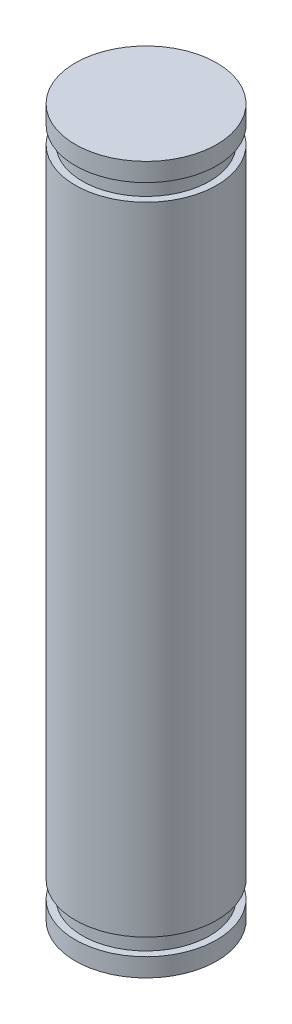
ISO-10303-21;
HEADER;
FILE_DESCRIPTION(('STEP AP214'),'2;1');
FILE_NAME('part.step','',(''),(''),'','','');
FILE_SCHEMA(('AUTOMOTIVE_DESIGN { 1 0 10303 214 1 1 1 1 }'));
ENDSEC;
DATA;
#1=APPLICATION_CONTEXT('core data for automotive mechanical design processes');
#2=APPLICATION_PROTOCOL_DEFINITION('international standard','automotive_design',2000,#1);
#3=PRODUCT_CONTEXT('',#1,'mechanical');
#4=PRODUCT('Part','Part','',(#3));
#5=PRODUCT_RELATED_PRODUCT_CATEGORY('part','',(#4));
#6=PRODUCT_DEFINITION_FORMATION('','',#4);
#7=PRODUCT_DEFINITION_CONTEXT('part definition',#1,'design');
#8=PRODUCT_DEFINITION('design','',#6,#7);
#9=PRODUCT_DEFINITION_SHAPE('','',#8);
#10=(LENGTH_UNIT() NAMED_UNIT(*) SI_UNIT(.MILLI.,.METRE.));
#11=(NAMED_UNIT(*) PLANE_ANGLE_UNIT() SI_UNIT($,.RADIAN.));
#12=(NAMED_UNIT(*) SI_UNIT($,.STERADIAN.) SOLID_ANGLE_UNIT());
#13=UNCERTAINTY_MEASURE_WITH_UNIT(LENGTH_MEASURE(1.E-05),#10,'distance_accuracy_value','');
#14=(GEOMETRIC_REPRESENTATION_CONTEXT(3) GLOBAL_UNCERTAINTY_ASSIGNED_CONTEXT((#13)) GLOBAL_UNIT_ASSIGNED_CONTEXT((#10,
#11,#12)) REPRESENTATION_CONTEXT('',''));
#15=CARTESIAN_POINT('',(0.,0.,0.));
#16=DIRECTION('',(0.,0.,1.));
#17=DIRECTION('',(1.,0.,0.));
#18=AXIS2_PLACEMENT_3D('',#15,#16,#17);
#19=CARTESIAN_POINT('',(0.,0.,0.));
#20=DIRECTION('',(0.,-1.,0.));
#21=DIRECTION('',(0.,0.,-1.));
#22=AXIS2_PLACEMENT_3D('',#19,#20,#21);
#23=PLANE('',#22);
#24=CARTESIAN_POINT('',(0.,0.,0.));
#25=DIRECTION('',(0.,-1.,0.));
#26=DIRECTION('',(0.,0.,-1.));
#27=AXIS2_PLACEMENT_3D('',#24,#25,#26);
#28=CIRCLE('',#27,5.);
#29=CARTESIAN_POINT('',(0.,0.,-5.));
#30=VERTEX_POINT('',#29);
#31=EDGE_CURVE('E10',#30,#30,#28,.T.);
#32=ORIENTED_EDGE('',*,*,#31,.T.);
#33=EDGE_LOOP('',(#32));
#34=FACE_BOUND('',#33,.T.);
#35=ADVANCED_FACE('F37',(#34),#23,.T.);
#36=CARTESIAN_POINT('',(0.,0.,0.));
#37=DIRECTION('',(0.,-1.,0.));
#38=DIRECTION('',(0.,0.,-1.));
#39=AXIS2_PLACEMENT_3D('',#36,#37,#38);
#40=CYLINDRICAL_SURFACE('',#39,5.);
#41=CARTESIAN_POINT('',(0.,1.3,0.));
#42=DIRECTION('',(0.,-1.,0.));
#43=DIRECTION('',(0.,0.,-1.));
#44=AXIS2_PLACEMENT_3D('',#41,#42,#43);
#45=CIRCLE('',#44,5.);
#46=CARTESIAN_POINT('',(0.,1.3,-5.));
#47=VERTEX_POINT('',#46);
#48=EDGE_CURVE('E44',#47,#47,#45,.T.);
#49=ORIENTED_EDGE('',*,*,#48,.T.);
#50=EDGE_LOOP('',(#49));
#51=FACE_BOUND('',#50,.T.);
#52=ORIENTED_EDGE('',*,*,#31,.F.);
#53=EDGE_LOOP('',(#52));
#54=FACE_BOUND('',#53,.T.);
#55=ADVANCED_FACE('F97',(#51,#54),#40,.T.);
#56=CARTESIAN_POINT('',(5.,1.3,0.));
#57=DIRECTION('',(0.,1.,0.));
#58=DIRECTION('',(0.,0.,1.));
#59=AXIS2_PLACEMENT_3D('',#56,#57,#58);
#60=PLANE('',#59);
#61=CARTESIAN_POINT('',(0.,1.3,0.));
#62=DIRECTION('',(0.,-1.,0.));
#63=DIRECTION('',(0.,0.,-1.));
#64=AXIS2_PLACEMENT_3D('',#61,#62,#63);
#65=CIRCLE('',#64,4.5);
#66=CARTESIAN_POINT('',(0.,1.3,-4.5));
#67=VERTEX_POINT('',#66);
#68=EDGE_CURVE('E49',#67,#67,#65,.T.);
#69=ORIENTED_EDGE('',*,*,#68,.T.);
#70=EDGE_LOOP('',(#69));
#71=FACE_BOUND('',#70,.T.);
#72=ORIENTED_EDGE('',*,*,#48,.F.);
#73=EDGE_LOOP('',(#72));
#74=FACE_BOUND('',#73,.T.);
#75=ADVANCED_FACE('F101',(#71,#74),#60,.T.);
#76=CARTESIAN_POINT('',(0.,0.,0.));
#77=DIRECTION('',(0.,-1.,0.));
#78=DIRECTION('',(0.,0.,-1.));
#79=AXIS2_PLACEMENT_3D('',#76,#77,#78);
#80=CYLINDRICAL_SURFACE('',#79,4.5);
#81=CARTESIAN_POINT('',(0.,2.5,0.));
#82=DIRECTION('',(0.,-1.,0.));
#83=DIRECTION('',(0.,0.,-1.));
#84=AXIS2_PLACEMENT_3D('',#81,#82,#83);
#85=CIRCLE('',#84,4.5);
#86=CARTESIAN_POINT('',(0.,2.5,-4.5));
#87=VERTEX_POINT('',#86);
#88=EDGE_CURVE('E54',#87,#87,#85,.T.);
#89=ORIENTED_EDGE('',*,*,#88,.T.);
#90=EDGE_LOOP('',(#89));
#91=FACE_BOUND('',#90,.T.);
#92=ORIENTED_EDGE('',*,*,#68,.F.);
#93=EDGE_LOOP('',(#92));
#94=FACE_BOUND('',#93,.T.);
#95=ADVANCED_FACE('F105',(#91,#94),#80,.T.);
#96=CARTESIAN_POINT('',(4.5,2.5,0.));
#97=DIRECTION('',(0.,-1.,0.));
#98=DIRECTION('',(0.,0.,-1.));
#99=AXIS2_PLACEMENT_3D('',#96,#97,#98);
#100=PLANE('',#99);
#101=CARTESIAN_POINT('',(0.,2.5,0.));
#102=DIRECTION('',(0.,-1.,0.));
#103=DIRECTION('',(0.,0.,-1.));
#104=AXIS2_PLACEMENT_3D('',#101,#102,#103);
#105=CIRCLE('',#104,5.);
#106=CARTESIAN_POINT('',(0.,2.5,-5.));
#107=VERTEX_POINT('',#106);
#108=EDGE_CURVE('E60',#107,#107,#105,.T.);
#109=ORIENTED_EDGE('',*,*,#108,.T.);
#110=EDGE_LOOP('',(#109));
#111=FACE_BOUND('',#110,.T.);
#112=ORIENTED_EDGE('',*,*,#88,.F.);
#113=EDGE_LOOP('',(#112));
#114=FACE_BOUND('',#113,.T.);
#115=ADVANCED_FACE('F112',(#111,#114),#100,.T.);
#116=CARTESIAN_POINT('',(0.,0.,0.));
#117=DIRECTION('',(0.,-1.,0.));
#118=DIRECTION('',(0.,0.,-1.));
#119=AXIS2_PLACEMENT_3D('',#116,#117,#118);
#120=CYLINDRICAL_SURFACE('',#119,5.);
#121=CARTESIAN_POINT('',(0.,47.5,0.));
#122=DIRECTION('',(0.,-1.,0.));
#123=DIRECTION('',(0.,0.,-1.));
#124=AXIS2_PLACEMENT_3D('',#121,#122,#123);
#125=CIRCLE('',#124,5.);
#126=CARTESIAN_POINT('',(0.,47.5,-5.));
#127=VERTEX_POINT('',#126);
#128=EDGE_CURVE('E64',#127,#127,#125,.T.);
#129=ORIENTED_EDGE('',*,*,#128,.T.);
#130=EDGE_LOOP('',(#129));
#131=FACE_BOUND('',#130,.T.);
#132=ORIENTED_EDGE('',*,*,#108,.F.);
#133=EDGE_LOOP('',(#132));
#134=FACE_BOUND('',#133,.T.);
#135=ADVANCED_FACE('F116',(#131,#134),#120,.T.);
#136=CARTESIAN_POINT('',(5.,47.5,0.));
#137=DIRECTION('',(0.,1.,0.));
#138=DIRECTION('',(0.,0.,1.));
#139=AXIS2_PLACEMENT_3D('',#136,#137,#138);
#140=PLANE('',#139);
#141=CARTESIAN_POINT('',(0.,47.5,0.));
#142=DIRECTION('',(0.,-1.,0.));
#143=DIRECTION('',(0.,0.,-1.));
#144=AXIS2_PLACEMENT_3D('',#141,#142,#143);
#145=CIRCLE('',#144,4.5);
#146=CARTESIAN_POINT('',(0.,47.5,-4.5));
#147=VERTEX_POINT('',#146);
#148=EDGE_CURVE('E68',#147,#147,#145,.T.);
#149=ORIENTED_EDGE('',*,*,#148,.T.);
#150=EDGE_LOOP('',(#149));
#151=FACE_BOUND('',#150,.T.);
#152=ORIENTED_EDGE('',*,*,#128,.F.);
#153=EDGE_LOOP('',(#152));
#154=FACE_BOUND('',#153,.T.);
#155=ADVANCED_FACE('F120',(#151,#154),#140,.T.);
#156=CARTESIAN_POINT('',(0.,0.,0.));
#157=DIRECTION('',(0.,-1.,0.));
#158=DIRECTION('',(0.,0.,-1.));
#159=AXIS2_PLACEMENT_3D('',#156,#157,#158);
#160=CYLINDRICAL_SURFACE('',#159,4.5);
#161=CARTESIAN_POINT('',(0.,48.7,0.));
#162=DIRECTION('',(0.,-1.,0.));
#163=DIRECTION('',(0.,0.,-1.));
#164=AXIS2_PLACEMENT_3D('',#161,#162,#163);
#165=CIRCLE('',#164,4.5);
#166=CARTESIAN_POINT('',(0.,48.7,-4.5));
#167=VERTEX_POINT('',#166);
#168=EDGE_CURVE('E72',#167,#167,#165,.T.);
#169=ORIENTED_EDGE('',*,*,#168,.T.);
#170=EDGE_LOOP('',(#169));
#171=FACE_BOUND('',#170,.T.);
#172=ORIENTED_EDGE('',*,*,#148,.F.);
#173=EDGE_LOOP('',(#172));
#174=FACE_BOUND('',#173,.T.);
#175=ADVANCED_FACE('F124',(#171,#174),#160,.T.);
#176=CARTESIAN_POINT('',(4.5,48.7,0.));
#177=DIRECTION('',(0.,-1.,0.));
#178=DIRECTION('',(0.,0.,-1.));
#179=AXIS2_PLACEMENT_3D('',#176,#177,#178);
#180=PLANE('',#179);
#181=CARTESIAN_POINT('',(0.,48.7,0.));
#182=DIRECTION('',(0.,-1.,0.));
#183=DIRECTION('',(0.,0.,-1.));
#184=AXIS2_PLACEMENT_3D('',#181,#182,#183);
#185=CIRCLE('',#184,5.);
#186=CARTESIAN_POINT('',(0.,48.7,-5.));
#187=VERTEX_POINT('',#186);
#188=EDGE_CURVE('E76',#187,#187,#185,.T.);
#189=ORIENTED_EDGE('',*,*,#188,.T.);
#190=EDGE_LOOP('',(#189));
#191=FACE_BOUND('',#190,.T.);
#192=ORIENTED_EDGE('',*,*,#168,.F.);
#193=EDGE_LOOP('',(#192));
#194=FACE_BOUND('',#193,.T.);
#195=ADVANCED_FACE('F94',(#191,#194),#180,.T.);
#196=CARTESIAN_POINT('',(0.,0.,0.));
#197=DIRECTION('',(0.,-1.,0.));
#198=DIRECTION('',(0.,0.,-1.));
#199=AXIS2_PLACEMENT_3D('',#196,#197,#198);
#200=CYLINDRICAL_SURFACE('',#199,5.);
#201=CARTESIAN_POINT('',(0.,50.,0.));
#202=DIRECTION('',(0.,-1.,0.));
#203=DIRECTION('',(0.,0.,-1.));
#204=AXIS2_PLACEMENT_3D('',#201,#202,#203);
#205=CIRCLE('',#204,5.);
#206=CARTESIAN_POINT('',(0.,50.,-5.));
#207=VERTEX_POINT('',#206);
#208=EDGE_CURVE('E80',#207,#207,#205,.T.);
#209=ORIENTED_EDGE('',*,*,#208,.T.);
#210=EDGE_LOOP('',(#209));
#211=FACE_BOUND('',#210,.T.);
#212=ORIENTED_EDGE('',*,*,#188,.F.);
#213=EDGE_LOOP('',(#212));
#214=FACE_BOUND('',#213,.T.);
#215=ADVANCED_FACE('F85',(#211,#214),#200,.T.);
#216=CARTESIAN_POINT('',(5.,50.,0.));
#217=DIRECTION('',(0.,1.,0.));
#218=DIRECTION('',(0.,0.,1.));
#219=AXIS2_PLACEMENT_3D('',#216,#217,#218);
#220=PLANE('',#219);
#221=ORIENTED_EDGE('',*,*,#208,.F.);
#222=EDGE_LOOP('',(#221));
#223=FACE_BOUND('',#222,.T.);
#224=ADVANCED_FACE('F88',(#223),#220,.T.);
#225=CLOSED_SHELL('',(#35,#55,#75,#95,#115,#135,#155,#175,#195,#215,#224));
#226=MANIFOLD_SOLID_BREP('B2',#225);
#227=ADVANCED_BREP_SHAPE_REPRESENTATION('',(#18,#226),#14);
#228=SHAPE_DEFINITION_REPRESENTATION(#9,#227);
ENDSEC;
END-ISO-10303-21;
